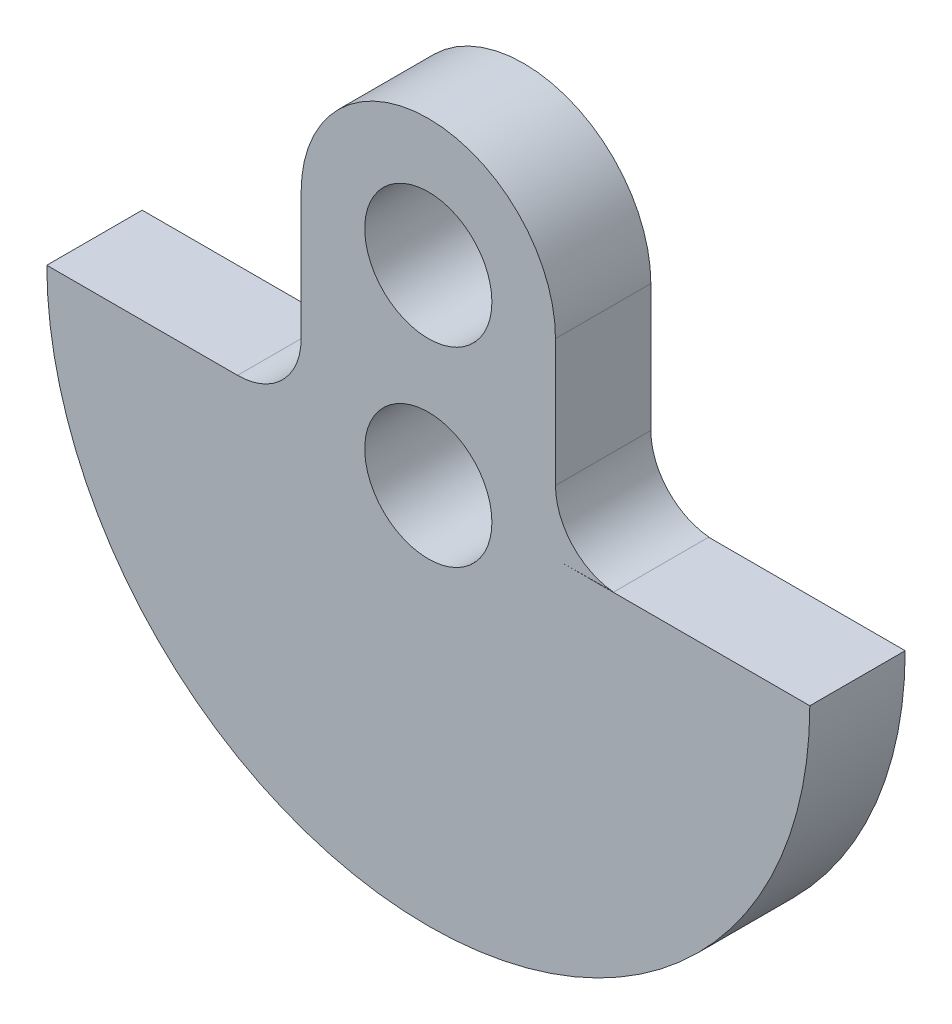
ISO-10303-21;
HEADER;
FILE_DESCRIPTION(('STEP AP214'),'2;1');
FILE_NAME('part.step','',(''),(''),'','','');
FILE_SCHEMA(('AUTOMOTIVE_DESIGN { 1 0 10303 214 1 1 1 1 }'));
ENDSEC;
DATA;
#1=APPLICATION_CONTEXT('core data for automotive mechanical design processes');
#2=APPLICATION_PROTOCOL_DEFINITION('international standard','automotive_design',2000,#1);
#3=PRODUCT_CONTEXT('',#1,'mechanical');
#4=PRODUCT('Part','Part','',(#3));
#5=PRODUCT_RELATED_PRODUCT_CATEGORY('part','',(#4));
#6=PRODUCT_DEFINITION_FORMATION('','',#4);
#7=PRODUCT_DEFINITION_CONTEXT('part definition',#1,'design');
#8=PRODUCT_DEFINITION('design','',#6,#7);
#9=PRODUCT_DEFINITION_SHAPE('','',#8);
#10=(LENGTH_UNIT() NAMED_UNIT(*) SI_UNIT(.MILLI.,.METRE.));
#11=(NAMED_UNIT(*) PLANE_ANGLE_UNIT() SI_UNIT($,.RADIAN.));
#12=(NAMED_UNIT(*) SI_UNIT($,.STERADIAN.) SOLID_ANGLE_UNIT());
#13=UNCERTAINTY_MEASURE_WITH_UNIT(LENGTH_MEASURE(1.E-05),#10,'distance_accuracy_value','');
#14=(GEOMETRIC_REPRESENTATION_CONTEXT(3) GLOBAL_UNCERTAINTY_ASSIGNED_CONTEXT((#13)) GLOBAL_UNIT_ASSIGNED_CONTEXT((#10,
#11,#12)) REPRESENTATION_CONTEXT('',''));
#15=CARTESIAN_POINT('',(0.,0.,0.));
#16=DIRECTION('',(0.,0.,1.));
#17=DIRECTION('',(1.,0.,0.));
#18=AXIS2_PLACEMENT_3D('',#15,#16,#17);
#19=CARTESIAN_POINT('',(20.,30.,0.));
#20=DIRECTION('',(1.,0.,0.));
#21=DIRECTION('',(0.,0.,-1.));
#22=AXIS2_PLACEMENT_3D('',#19,#20,#21);
#23=PLANE('',#22);
#24=DIRECTION('',(0.,1.,0.));
#25=VECTOR('',#24,1.);
#26=CARTESIAN_POINT('',(20.,30.,15.));
#27=LINE('',#26,#25);
#28=CARTESIAN_POINT('',(20.,10.,15.));
#29=VERTEX_POINT('',#28);
#30=CARTESIAN_POINT('',(20.,30.,15.));
#31=VERTEX_POINT('',#30);
#32=EDGE_CURVE('E127',#29,#31,#27,.T.);
#33=ORIENTED_EDGE('',*,*,#32,.F.);
#34=DIRECTION('',(0.,0.,1.));
#35=VECTOR('',#34,1.);
#36=CARTESIAN_POINT('',(20.,10.,0.));
#37=LINE('',#36,#35);
#38=CARTESIAN_POINT('',(20.,10.,0.));
#39=VERTEX_POINT('',#38);
#40=EDGE_CURVE('E150',#39,#29,#37,.T.);
#41=ORIENTED_EDGE('',*,*,#40,.F.);
#42=DIRECTION('',(0.,1.,0.));
#43=VECTOR('',#42,1.);
#44=CARTESIAN_POINT('',(20.,30.,0.));
#45=LINE('',#44,#43);
#46=CARTESIAN_POINT('',(20.,30.,0.));
#47=VERTEX_POINT('',#46);
#48=EDGE_CURVE('E124',#39,#47,#45,.T.);
#49=ORIENTED_EDGE('',*,*,#48,.T.);
#50=DIRECTION('',(0.,0.,1.));
#51=VECTOR('',#50,1.);
#52=CARTESIAN_POINT('',(20.,30.,0.));
#53=LINE('',#52,#51);
#54=EDGE_CURVE('E104',#47,#31,#53,.T.);
#55=ORIENTED_EDGE('',*,*,#54,.T.);
#56=EDGE_LOOP('',(#33,#41,#49,#55));
#57=FACE_BOUND('',#56,.T.);
#58=ADVANCED_FACE('F42',(#57),#23,.T.);
#59=CARTESIAN_POINT('',(-60.,0.,15.));
#60=DIRECTION('',(0.,-1.,0.));
#61=DIRECTION('',(0.,0.,-1.));
#62=AXIS2_PLACEMENT_3D('',#59,#60,#61);
#63=PLANE('',#62);
#64=DIRECTION('',(-1.,0.,0.));
#65=VECTOR('',#64,1.);
#66=CARTESIAN_POINT('',(-60.,0.,0.));
#67=LINE('',#66,#65);
#68=CARTESIAN_POINT('',(60.,0.,0.));
#69=VERTEX_POINT('',#68);
#70=CARTESIAN_POINT('',(20.,0.,0.));
#71=VERTEX_POINT('',#70);
#72=EDGE_CURVE('E91',#69,#71,#67,.T.);
#73=ORIENTED_EDGE('',*,*,#72,.T.);
#74=DIRECTION('',(0.,0.,1.));
#75=VECTOR('',#74,1.);
#76=CARTESIAN_POINT('',(20.,0.,0.));
#77=LINE('',#76,#75);
#78=CARTESIAN_POINT('',(20.,0.,15.));
#79=VERTEX_POINT('',#78);
#80=EDGE_CURVE('E108',#71,#79,#77,.T.);
#81=ORIENTED_EDGE('',*,*,#80,.T.);
#82=DIRECTION('',(-1.,0.,0.));
#83=VECTOR('',#82,1.);
#84=CARTESIAN_POINT('',(-60.,0.,15.));
#85=LINE('',#84,#83);
#86=CARTESIAN_POINT('',(60.,0.,15.));
#87=VERTEX_POINT('',#86);
#88=EDGE_CURVE('E99',#87,#79,#85,.T.);
#89=ORIENTED_EDGE('',*,*,#88,.F.);
#90=DIRECTION('',(0.,0.,-1.));
#91=VECTOR('',#90,1.);
#92=CARTESIAN_POINT('',(60.,0.,15.));
#93=LINE('',#92,#91);
#94=EDGE_CURVE('E11',#87,#69,#93,.T.);
#95=ORIENTED_EDGE('',*,*,#94,.T.);
#96=EDGE_LOOP('',(#73,#81,#89,#95));
#97=FACE_BOUND('',#96,.T.);
#98=ADVANCED_FACE('F261',(#97),#63,.F.);
#99=CARTESIAN_POINT('',(0.,0.,15.));
#100=DIRECTION('',(0.,0.,-1.));
#101=DIRECTION('',(-1.,0.,0.));
#102=AXIS2_PLACEMENT_3D('',#99,#100,#101);
#103=CYLINDRICAL_SURFACE('',#102,60.);
#104=CARTESIAN_POINT('',(0.,0.,0.));
#105=DIRECTION('',(0.,0.,1.));
#106=DIRECTION('',(1.,0.,0.));
#107=AXIS2_PLACEMENT_3D('',#104,#105,#106);
#108=CIRCLE('',#107,60.);
#109=CARTESIAN_POINT('',(-60.,0.,0.));
#110=VERTEX_POINT('',#109);
#111=EDGE_CURVE('E92',#110,#69,#108,.T.);
#112=ORIENTED_EDGE('',*,*,#111,.T.);
#113=ORIENTED_EDGE('',*,*,#94,.F.);
#114=CARTESIAN_POINT('',(0.,0.,15.));
#115=DIRECTION('',(0.,0.,1.));
#116=DIRECTION('',(1.,0.,0.));
#117=AXIS2_PLACEMENT_3D('',#114,#115,#116);
#118=CIRCLE('',#117,60.);
#119=CARTESIAN_POINT('',(-60.,0.,15.));
#120=VERTEX_POINT('',#119);
#121=EDGE_CURVE('E97',#120,#87,#118,.T.);
#122=ORIENTED_EDGE('',*,*,#121,.F.);
#123=DIRECTION('',(0.,0.,-1.));
#124=VECTOR('',#123,1.);
#125=CARTESIAN_POINT('',(-60.,0.,15.));
#126=LINE('',#125,#124);
#127=EDGE_CURVE('E51',#120,#110,#126,.T.);
#128=ORIENTED_EDGE('',*,*,#127,.T.);
#129=EDGE_LOOP('',(#112,#113,#122,#128));
#130=FACE_BOUND('',#129,.T.);
#131=ADVANCED_FACE('F44',(#130),#103,.T.);
#132=CARTESIAN_POINT('',(-30.,0.,15.));
#133=VERTEX_POINT('',#132);
#134=EDGE_CURVE('E66',#133,#120,#85,.T.);
#135=ORIENTED_EDGE('',*,*,#134,.F.);
#136=DIRECTION('',(0.,0.,1.));
#137=VECTOR('',#136,1.);
#138=CARTESIAN_POINT('',(-30.,0.,0.));
#139=LINE('',#138,#137);
#140=CARTESIAN_POINT('',(-30.,0.,0.));
#141=VERTEX_POINT('',#140);
#142=EDGE_CURVE('E86',#141,#133,#139,.T.);
#143=ORIENTED_EDGE('',*,*,#142,.F.);
#144=EDGE_CURVE('E80',#141,#110,#67,.T.);
#145=ORIENTED_EDGE('',*,*,#144,.T.);
#146=ORIENTED_EDGE('',*,*,#127,.F.);
#147=EDGE_LOOP('',(#135,#143,#145,#146));
#148=FACE_BOUND('',#147,.T.);
#149=ADVANCED_FACE('F82',(#148),#63,.F.);
#150=CARTESIAN_POINT('',(0.,0.,15.));
#151=DIRECTION('',(0.,0.,1.));
#152=DIRECTION('',(1.,0.,0.));
#153=AXIS2_PLACEMENT_3D('',#150,#151,#152);
#154=PLANE('',#153);
#155=CARTESIAN_POINT('',(0.,0.,15.));
#156=DIRECTION('',(0.,0.,1.));
#157=DIRECTION('',(1.,0.,0.));
#158=AXIS2_PLACEMENT_3D('',#155,#156,#157);
#159=CIRCLE('',#158,10.);
#160=CARTESIAN_POINT('',(10.,0.,15.));
#161=VERTEX_POINT('',#160);
#162=EDGE_CURVE('E191',#161,#161,#159,.T.);
#163=ORIENTED_EDGE('',*,*,#162,.F.);
#164=EDGE_LOOP('',(#163));
#165=FACE_BOUND('',#164,.T.);
#166=CARTESIAN_POINT('',(0.,30.,15.));
#167=DIRECTION('',(0.,0.,1.));
#168=DIRECTION('',(1.,0.,0.));
#169=AXIS2_PLACEMENT_3D('',#166,#167,#168);
#170=CIRCLE('',#169,10.);
#171=CARTESIAN_POINT('',(10.,30.,15.));
#172=VERTEX_POINT('',#171);
#173=EDGE_CURVE('E183',#172,#172,#170,.T.);
#174=ORIENTED_EDGE('',*,*,#173,.F.);
#175=EDGE_LOOP('',(#174));
#176=FACE_BOUND('',#175,.T.);
#177=CARTESIAN_POINT('',(-30.,10.,15.));
#178=DIRECTION('',(0.,0.,-1.));
#179=DIRECTION('',(1.,0.,0.));
#180=AXIS2_PLACEMENT_3D('',#177,#178,#179);
#181=CIRCLE('',#180,10.);
#182=CARTESIAN_POINT('',(-20.,10.,15.));
#183=VERTEX_POINT('',#182);
#184=EDGE_CURVE('E176',#183,#133,#181,.T.);
#185=ORIENTED_EDGE('',*,*,#184,.T.);
#186=ORIENTED_EDGE('',*,*,#134,.T.);
#187=ORIENTED_EDGE('',*,*,#121,.T.);
#188=ORIENTED_EDGE('',*,*,#88,.T.);
#189=DIRECTION('',(0.999991086088788,0.00422229119858523,0.));
#190=VECTOR('',#189,1.);
#191=CARTESIAN_POINT('',(20.,0.,15.));
#192=LINE('',#191,#190);
#193=CARTESIAN_POINT('',(29.1231124556876,0.0385207807961727,15.));
#194=VERTEX_POINT('',#193);
#195=EDGE_CURVE('E157',#79,#194,#192,.T.);
#196=ORIENTED_EDGE('',*,*,#195,.T.);
#197=CARTESIAN_POINT('',(30.,10.,15.));
#198=DIRECTION('',(0.,0.,-1.));
#199=DIRECTION('',(1.,0.,0.));
#200=AXIS2_PLACEMENT_3D('',#197,#198,#199);
#201=CIRCLE('',#200,10.);
#202=EDGE_CURVE('E58',#194,#29,#201,.T.);
#203=ORIENTED_EDGE('',*,*,#202,.T.);
#204=ORIENTED_EDGE('',*,*,#32,.T.);
#205=CARTESIAN_POINT('',(0.,30.,15.));
#206=DIRECTION('',(0.,0.,1.));
#207=DIRECTION('',(1.,0.,0.));
#208=AXIS2_PLACEMENT_3D('',#205,#206,#207);
#209=CIRCLE('',#208,20.);
#210=CARTESIAN_POINT('',(-20.,30.,15.));
#211=VERTEX_POINT('',#210);
#212=EDGE_CURVE('E135',#31,#211,#209,.T.);
#213=ORIENTED_EDGE('',*,*,#212,.T.);
#214=DIRECTION('',(0.,-1.,0.));
#215=VECTOR('',#214,1.);
#216=CARTESIAN_POINT('',(-20.,30.,15.));
#217=LINE('',#216,#215);
#218=EDGE_CURVE('E131',#211,#183,#217,.T.);
#219=ORIENTED_EDGE('',*,*,#218,.T.);
#220=EDGE_LOOP('',(#185,#186,#187,#188,#196,#203,#204,#213,#219));
#221=FACE_BOUND('',#220,.T.);
#222=ADVANCED_FACE('F208',(#165,#176,#221),#154,.T.);
#223=CARTESIAN_POINT('',(0.,0.,0.));
#224=DIRECTION('',(0.,0.,1.));
#225=DIRECTION('',(1.,0.,0.));
#226=AXIS2_PLACEMENT_3D('',#223,#224,#225);
#227=PLANE('',#226);
#228=CARTESIAN_POINT('',(0.,0.,0.));
#229=DIRECTION('',(0.,0.,1.));
#230=DIRECTION('',(1.,0.,0.));
#231=AXIS2_PLACEMENT_3D('',#228,#229,#230);
#232=CIRCLE('',#231,10.);
#233=CARTESIAN_POINT('',(10.,0.,0.));
#234=VERTEX_POINT('',#233);
#235=EDGE_CURVE('E187',#234,#234,#232,.T.);
#236=ORIENTED_EDGE('',*,*,#235,.T.);
#237=EDGE_LOOP('',(#236));
#238=FACE_BOUND('',#237,.T.);
#239=CARTESIAN_POINT('',(0.,30.,0.));
#240=DIRECTION('',(0.,0.,1.));
#241=DIRECTION('',(1.,0.,0.));
#242=AXIS2_PLACEMENT_3D('',#239,#240,#241);
#243=CIRCLE('',#242,10.);
#244=CARTESIAN_POINT('',(10.,30.,0.));
#245=VERTEX_POINT('',#244);
#246=EDGE_CURVE('E179',#245,#245,#243,.T.);
#247=ORIENTED_EDGE('',*,*,#246,.T.);
#248=EDGE_LOOP('',(#247));
#249=FACE_BOUND('',#248,.T.);
#250=ORIENTED_EDGE('',*,*,#144,.F.);
#251=CARTESIAN_POINT('',(-30.,10.,0.));
#252=DIRECTION('',(0.,0.,-1.));
#253=DIRECTION('',(1.,0.,0.));
#254=AXIS2_PLACEMENT_3D('',#251,#252,#253);
#255=CIRCLE('',#254,10.);
#256=CARTESIAN_POINT('',(-20.,10.,0.));
#257=VERTEX_POINT('',#256);
#258=EDGE_CURVE('E172',#257,#141,#255,.T.);
#259=ORIENTED_EDGE('',*,*,#258,.F.);
#260=DIRECTION('',(0.,-1.,0.));
#261=VECTOR('',#260,1.);
#262=CARTESIAN_POINT('',(-20.,30.,0.));
#263=LINE('',#262,#261);
#264=CARTESIAN_POINT('',(-20.,30.,0.));
#265=VERTEX_POINT('',#264);
#266=EDGE_CURVE('E143',#265,#257,#263,.T.);
#267=ORIENTED_EDGE('',*,*,#266,.F.);
#268=CARTESIAN_POINT('',(0.,30.,0.));
#269=DIRECTION('',(0.,0.,1.));
#270=DIRECTION('',(1.,0.,0.));
#271=AXIS2_PLACEMENT_3D('',#268,#269,#270);
#272=CIRCLE('',#271,20.);
#273=EDGE_CURVE('E130',#47,#265,#272,.T.);
#274=ORIENTED_EDGE('',*,*,#273,.F.);
#275=ORIENTED_EDGE('',*,*,#48,.F.);
#276=CARTESIAN_POINT('',(30.,10.,0.));
#277=DIRECTION('',(0.,0.,-1.));
#278=DIRECTION('',(1.,0.,0.));
#279=AXIS2_PLACEMENT_3D('',#276,#277,#278);
#280=CIRCLE('',#279,10.);
#281=CARTESIAN_POINT('',(29.1231124556876,0.0385207807961727,0.));
#282=VERTEX_POINT('',#281);
#283=EDGE_CURVE('E160',#282,#39,#280,.T.);
#284=ORIENTED_EDGE('',*,*,#283,.F.);
#285=DIRECTION('',(0.999991086088788,0.00422229119858523,0.));
#286=VECTOR('',#285,1.);
#287=CARTESIAN_POINT('',(20.,0.,0.));
#288=LINE('',#287,#286);
#289=EDGE_CURVE('E153',#71,#282,#288,.T.);
#290=ORIENTED_EDGE('',*,*,#289,.F.);
#291=ORIENTED_EDGE('',*,*,#72,.F.);
#292=ORIENTED_EDGE('',*,*,#111,.F.);
#293=EDGE_LOOP('',(#250,#259,#267,#274,#275,#284,#290,#291,#292));
#294=FACE_BOUND('',#293,.T.);
#295=ADVANCED_FACE('F100',(#238,#249,#294),#227,.F.);
#296=CARTESIAN_POINT('',(0.,30.,0.));
#297=DIRECTION('',(0.,0.,1.));
#298=DIRECTION('',(1.,0.,0.));
#299=AXIS2_PLACEMENT_3D('',#296,#297,#298);
#300=CYLINDRICAL_SURFACE('',#299,20.);
#301=ORIENTED_EDGE('',*,*,#212,.F.);
#302=ORIENTED_EDGE('',*,*,#54,.F.);
#303=ORIENTED_EDGE('',*,*,#273,.T.);
#304=DIRECTION('',(0.,0.,1.));
#305=VECTOR('',#304,1.);
#306=CARTESIAN_POINT('',(-20.,30.,0.));
#307=LINE('',#306,#305);
#308=EDGE_CURVE('E120',#265,#211,#307,.T.);
#309=ORIENTED_EDGE('',*,*,#308,.T.);
#310=EDGE_LOOP('',(#301,#302,#303,#309));
#311=FACE_BOUND('',#310,.T.);
#312=ADVANCED_FACE('F238',(#311),#300,.T.);
#313=CARTESIAN_POINT('',(-20.,30.,0.));
#314=DIRECTION('',(-1.,0.,0.));
#315=DIRECTION('',(0.,0.,1.));
#316=AXIS2_PLACEMENT_3D('',#313,#314,#315);
#317=PLANE('',#316);
#318=DIRECTION('',(0.,0.,1.));
#319=VECTOR('',#318,1.);
#320=CARTESIAN_POINT('',(-20.,10.,0.));
#321=LINE('',#320,#319);
#322=EDGE_CURVE('E163',#257,#183,#321,.T.);
#323=ORIENTED_EDGE('',*,*,#322,.T.);
#324=ORIENTED_EDGE('',*,*,#218,.F.);
#325=ORIENTED_EDGE('',*,*,#308,.F.);
#326=ORIENTED_EDGE('',*,*,#266,.T.);
#327=EDGE_LOOP('',(#323,#324,#325,#326));
#328=FACE_BOUND('',#327,.T.);
#329=ADVANCED_FACE('F224',(#328),#317,.T.);
#330=CARTESIAN_POINT('',(30.,10.,0.));
#331=DIRECTION('',(0.,0.,1.));
#332=DIRECTION('',(1.,0.,0.));
#333=AXIS2_PLACEMENT_3D('',#330,#331,#332);
#334=CYLINDRICAL_SURFACE('',#333,10.);
#335=ORIENTED_EDGE('',*,*,#202,.F.);
#336=DIRECTION('',(0.,0.,1.));
#337=VECTOR('',#336,1.);
#338=CARTESIAN_POINT('',(29.1231124556876,0.0385207807961727,0.));
#339=LINE('',#338,#337);
#340=EDGE_CURVE('E139',#282,#194,#339,.T.);
#341=ORIENTED_EDGE('',*,*,#340,.F.);
#342=ORIENTED_EDGE('',*,*,#283,.T.);
#343=ORIENTED_EDGE('',*,*,#40,.T.);
#344=EDGE_LOOP('',(#335,#341,#342,#343));
#345=FACE_BOUND('',#344,.T.);
#346=ADVANCED_FACE('F258',(#345),#334,.F.);
#347=CARTESIAN_POINT('',(20.,0.,0.));
#348=DIRECTION('',(0.00422229119858523,-0.999991086088788,0.));
#349=DIRECTION('',(0.999991086088788,0.00422229119858523,0.));
#350=AXIS2_PLACEMENT_3D('',#347,#348,#349);
#351=PLANE('',#350);
#352=ORIENTED_EDGE('',*,*,#195,.F.);
#353=ORIENTED_EDGE('',*,*,#80,.F.);
#354=ORIENTED_EDGE('',*,*,#289,.T.);
#355=ORIENTED_EDGE('',*,*,#340,.T.);
#356=EDGE_LOOP('',(#352,#353,#354,#355));
#357=FACE_BOUND('',#356,.T.);
#358=ADVANCED_FACE('F260',(#357),#351,.T.);
#359=CARTESIAN_POINT('',(-30.,10.,0.));
#360=DIRECTION('',(0.,0.,1.));
#361=DIRECTION('',(1.,0.,0.));
#362=AXIS2_PLACEMENT_3D('',#359,#360,#361);
#363=CYLINDRICAL_SURFACE('',#362,10.);
#364=ORIENTED_EDGE('',*,*,#184,.F.);
#365=ORIENTED_EDGE('',*,*,#322,.F.);
#366=ORIENTED_EDGE('',*,*,#258,.T.);
#367=ORIENTED_EDGE('',*,*,#142,.T.);
#368=EDGE_LOOP('',(#364,#365,#366,#367));
#369=FACE_BOUND('',#368,.T.);
#370=ADVANCED_FACE('F220',(#369),#363,.F.);
#371=CARTESIAN_POINT('',(0.,30.,0.));
#372=DIRECTION('',(0.,0.,1.));
#373=DIRECTION('',(1.,0.,0.));
#374=AXIS2_PLACEMENT_3D('',#371,#372,#373);
#375=CYLINDRICAL_SURFACE('',#374,10.);
#376=ORIENTED_EDGE('',*,*,#246,.F.);
#377=EDGE_LOOP('',(#376));
#378=FACE_BOUND('',#377,.T.);
#379=ORIENTED_EDGE('',*,*,#173,.T.);
#380=EDGE_LOOP('',(#379));
#381=FACE_BOUND('',#380,.T.);
#382=ADVANCED_FACE('F204',(#378,#381),#375,.F.);
#383=CARTESIAN_POINT('',(0.,0.,0.));
#384=DIRECTION('',(0.,0.,1.));
#385=DIRECTION('',(1.,0.,0.));
#386=AXIS2_PLACEMENT_3D('',#383,#384,#385);
#387=CYLINDRICAL_SURFACE('',#386,10.);
#388=ORIENTED_EDGE('',*,*,#235,.F.);
#389=EDGE_LOOP('',(#388));
#390=FACE_BOUND('',#389,.T.);
#391=ORIENTED_EDGE('',*,*,#162,.T.);
#392=EDGE_LOOP('',(#391));
#393=FACE_BOUND('',#392,.T.);
#394=ADVANCED_FACE('F201',(#390,#393),#387,.F.);
#395=CLOSED_SHELL('',(#58,#98,#131,#149,#222,#295,#312,#329,#346,#358,#370,#382,#394));
#396=MANIFOLD_SOLID_BREP('B2',#395);
#397=ADVANCED_BREP_SHAPE_REPRESENTATION('',(#18,#396),#14);
#398=SHAPE_DEFINITION_REPRESENTATION(#9,#397);
ENDSEC;
END-ISO-10303-21;
